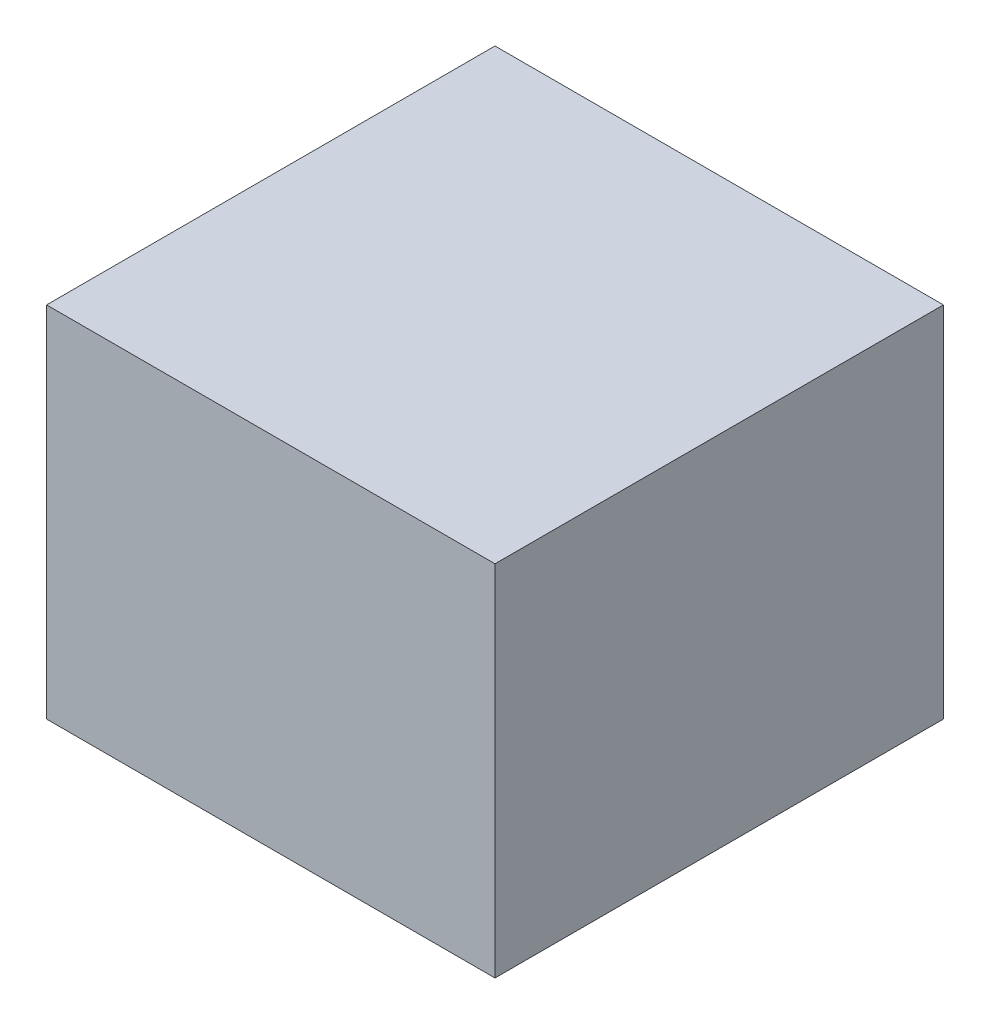
ISO-10303-21;
HEADER;
FILE_DESCRIPTION(('STEP AP214'),'2;1');
FILE_NAME('part.step','',(''),(''),'','','');
FILE_SCHEMA(('AUTOMOTIVE_DESIGN { 1 0 10303 214 1 1 1 1 }'));
ENDSEC;
DATA;
#1=APPLICATION_CONTEXT('core data for automotive mechanical design processes');
#2=APPLICATION_PROTOCOL_DEFINITION('international standard','automotive_design',2000,#1);
#3=PRODUCT_CONTEXT('',#1,'mechanical');
#4=PRODUCT('Part','Part','',(#3));
#5=PRODUCT_RELATED_PRODUCT_CATEGORY('part','',(#4));
#6=PRODUCT_DEFINITION_FORMATION('','',#4);
#7=PRODUCT_DEFINITION_CONTEXT('part definition',#1,'design');
#8=PRODUCT_DEFINITION('design','',#6,#7);
#9=PRODUCT_DEFINITION_SHAPE('','',#8);
#10=(LENGTH_UNIT() NAMED_UNIT(*) SI_UNIT(.MILLI.,.METRE.));
#11=(NAMED_UNIT(*) PLANE_ANGLE_UNIT() SI_UNIT($,.RADIAN.));
#12=(NAMED_UNIT(*) SI_UNIT($,.STERADIAN.) SOLID_ANGLE_UNIT());
#13=UNCERTAINTY_MEASURE_WITH_UNIT(LENGTH_MEASURE(1.E-05),#10,'distance_accuracy_value','');
#14=(GEOMETRIC_REPRESENTATION_CONTEXT(3) GLOBAL_UNCERTAINTY_ASSIGNED_CONTEXT((#13)) GLOBAL_UNIT_ASSIGNED_CONTEXT((#10,
#11,#12)) REPRESENTATION_CONTEXT('',''));
#15=CARTESIAN_POINT('',(0.,0.,0.));
#16=DIRECTION('',(0.,0.,1.));
#17=DIRECTION('',(1.,0.,0.));
#18=AXIS2_PLACEMENT_3D('',#15,#16,#17);
#19=CARTESIAN_POINT('',(8.75,14.,8.75));
#20=DIRECTION('',(-1.,0.,0.));
#21=DIRECTION('',(0.,0.,1.));
#22=AXIS2_PLACEMENT_3D('',#19,#20,#21);
#23=PLANE('',#22);
#24=DIRECTION('',(0.,0.,-1.));
#25=VECTOR('',#24,1.);
#26=CARTESIAN_POINT('',(8.75,0.,8.75));
#27=LINE('',#26,#25);
#28=CARTESIAN_POINT('',(8.75,0.,8.75));
#29=VERTEX_POINT('',#28);
#30=CARTESIAN_POINT('',(8.75,0.,-8.75));
#31=VERTEX_POINT('',#30);
#32=EDGE_CURVE('E96',#29,#31,#27,.T.);
#33=ORIENTED_EDGE('',*,*,#32,.T.);
#34=DIRECTION('',(0.,-1.,0.));
#35=VECTOR('',#34,1.);
#36=CARTESIAN_POINT('',(8.75,14.,-8.75));
#37=LINE('',#36,#35);
#38=CARTESIAN_POINT('',(8.75,14.,-8.75));
#39=VERTEX_POINT('',#38);
#40=EDGE_CURVE('E11',#39,#31,#37,.T.);
#41=ORIENTED_EDGE('',*,*,#40,.F.);
#42=DIRECTION('',(0.,0.,-1.));
#43=VECTOR('',#42,1.);
#44=CARTESIAN_POINT('',(8.75,14.,8.75));
#45=LINE('',#44,#43);
#46=CARTESIAN_POINT('',(8.75,14.,8.75));
#47=VERTEX_POINT('',#46);
#48=EDGE_CURVE('E84',#47,#39,#45,.T.);
#49=ORIENTED_EDGE('',*,*,#48,.F.);
#50=DIRECTION('',(0.,-1.,0.));
#51=VECTOR('',#50,1.);
#52=CARTESIAN_POINT('',(8.75,14.,8.75));
#53=LINE('',#52,#51);
#54=EDGE_CURVE('E92',#47,#29,#53,.T.);
#55=ORIENTED_EDGE('',*,*,#54,.T.);
#56=EDGE_LOOP('',(#33,#41,#49,#55));
#57=FACE_BOUND('',#56,.T.);
#58=ADVANCED_FACE('F33',(#57),#23,.F.);
#59=CARTESIAN_POINT('',(-8.75,14.,-8.75));
#60=DIRECTION('',(0.,0.,1.));
#61=DIRECTION('',(1.,0.,0.));
#62=AXIS2_PLACEMENT_3D('',#59,#60,#61);
#63=PLANE('',#62);
#64=DIRECTION('',(-1.,0.,0.));
#65=VECTOR('',#64,1.);
#66=CARTESIAN_POINT('',(-8.75,0.,-8.75));
#67=LINE('',#66,#65);
#68=CARTESIAN_POINT('',(-8.75,0.,-8.75));
#69=VERTEX_POINT('',#68);
#70=EDGE_CURVE('E88',#31,#69,#67,.T.);
#71=ORIENTED_EDGE('',*,*,#70,.T.);
#72=DIRECTION('',(0.,-1.,0.));
#73=VECTOR('',#72,1.);
#74=CARTESIAN_POINT('',(-8.75,14.,-8.75));
#75=LINE('',#74,#73);
#76=CARTESIAN_POINT('',(-8.75,14.,-8.75));
#77=VERTEX_POINT('',#76);
#78=EDGE_CURVE('E41',#77,#69,#75,.T.);
#79=ORIENTED_EDGE('',*,*,#78,.F.);
#80=DIRECTION('',(-1.,0.,0.));
#81=VECTOR('',#80,1.);
#82=CARTESIAN_POINT('',(-8.75,14.,-8.75));
#83=LINE('',#82,#81);
#84=EDGE_CURVE('E79',#39,#77,#83,.T.);
#85=ORIENTED_EDGE('',*,*,#84,.F.);
#86=ORIENTED_EDGE('',*,*,#40,.T.);
#87=EDGE_LOOP('',(#71,#79,#85,#86));
#88=FACE_BOUND('',#87,.T.);
#89=ADVANCED_FACE('F87',(#88),#63,.F.);
#90=CARTESIAN_POINT('',(-8.75,14.,8.75));
#91=DIRECTION('',(1.,0.,0.));
#92=DIRECTION('',(0.,0.,-1.));
#93=AXIS2_PLACEMENT_3D('',#90,#91,#92);
#94=PLANE('',#93);
#95=DIRECTION('',(0.,0.,1.));
#96=VECTOR('',#95,1.);
#97=CARTESIAN_POINT('',(-8.75,0.,8.75));
#98=LINE('',#97,#96);
#99=CARTESIAN_POINT('',(-8.75,0.,8.75));
#100=VERTEX_POINT('',#99);
#101=EDGE_CURVE('E66',#69,#100,#98,.T.);
#102=ORIENTED_EDGE('',*,*,#101,.T.);
#103=DIRECTION('',(0.,-1.,0.));
#104=VECTOR('',#103,1.);
#105=CARTESIAN_POINT('',(-8.75,14.,8.75));
#106=LINE('',#105,#104);
#107=CARTESIAN_POINT('',(-8.75,14.,8.75));
#108=VERTEX_POINT('',#107);
#109=EDGE_CURVE('E89',#108,#100,#106,.T.);
#110=ORIENTED_EDGE('',*,*,#109,.F.);
#111=DIRECTION('',(0.,0.,1.));
#112=VECTOR('',#111,1.);
#113=CARTESIAN_POINT('',(-8.75,14.,8.75));
#114=LINE('',#113,#112);
#115=EDGE_CURVE('E82',#77,#108,#114,.T.);
#116=ORIENTED_EDGE('',*,*,#115,.F.);
#117=ORIENTED_EDGE('',*,*,#78,.T.);
#118=EDGE_LOOP('',(#102,#110,#116,#117));
#119=FACE_BOUND('',#118,.T.);
#120=ADVANCED_FACE('F90',(#119),#94,.F.);
#121=CARTESIAN_POINT('',(-8.75,14.,8.75));
#122=DIRECTION('',(0.,0.,-1.));
#123=DIRECTION('',(-1.,0.,0.));
#124=AXIS2_PLACEMENT_3D('',#121,#122,#123);
#125=PLANE('',#124);
#126=DIRECTION('',(1.,0.,0.));
#127=VECTOR('',#126,1.);
#128=CARTESIAN_POINT('',(-8.75,0.,8.75));
#129=LINE('',#128,#127);
#130=EDGE_CURVE('E72',#100,#29,#129,.T.);
#131=ORIENTED_EDGE('',*,*,#130,.T.);
#132=ORIENTED_EDGE('',*,*,#54,.F.);
#133=DIRECTION('',(1.,0.,0.));
#134=VECTOR('',#133,1.);
#135=CARTESIAN_POINT('',(-8.75,14.,8.75));
#136=LINE('',#135,#134);
#137=EDGE_CURVE('E49',#108,#47,#136,.T.);
#138=ORIENTED_EDGE('',*,*,#137,.F.);
#139=ORIENTED_EDGE('',*,*,#109,.T.);
#140=EDGE_LOOP('',(#131,#132,#138,#139));
#141=FACE_BOUND('',#140,.T.);
#142=ADVANCED_FACE('F103',(#141),#125,.F.);
#143=CARTESIAN_POINT('',(0.,14.,0.));
#144=DIRECTION('',(0.,-1.,0.));
#145=DIRECTION('',(0.,0.,-1.));
#146=AXIS2_PLACEMENT_3D('',#143,#144,#145);
#147=PLANE('',#146);
#148=ORIENTED_EDGE('',*,*,#48,.T.);
#149=ORIENTED_EDGE('',*,*,#84,.T.);
#150=ORIENTED_EDGE('',*,*,#115,.T.);
#151=ORIENTED_EDGE('',*,*,#137,.T.);
#152=EDGE_LOOP('',(#148,#149,#150,#151));
#153=FACE_BOUND('',#152,.T.);
#154=ADVANCED_FACE('F80',(#153),#147,.F.);
#155=CARTESIAN_POINT('',(0.,0.,0.));
#156=DIRECTION('',(0.,-1.,0.));
#157=DIRECTION('',(0.,0.,-1.));
#158=AXIS2_PLACEMENT_3D('',#155,#156,#157);
#159=PLANE('',#158);
#160=ORIENTED_EDGE('',*,*,#32,.F.);
#161=ORIENTED_EDGE('',*,*,#130,.F.);
#162=ORIENTED_EDGE('',*,*,#101,.F.);
#163=ORIENTED_EDGE('',*,*,#70,.F.);
#164=EDGE_LOOP('',(#160,#161,#162,#163));
#165=FACE_BOUND('',#164,.T.);
#166=ADVANCED_FACE('F106',(#165),#159,.T.);
#167=CLOSED_SHELL('',(#58,#89,#120,#142,#154,#166));
#168=MANIFOLD_SOLID_BREP('B2',#167);
#169=ADVANCED_BREP_SHAPE_REPRESENTATION('',(#18,#168),#14);
#170=SHAPE_DEFINITION_REPRESENTATION(#9,#169);
ENDSEC;
END-ISO-10303-21;
